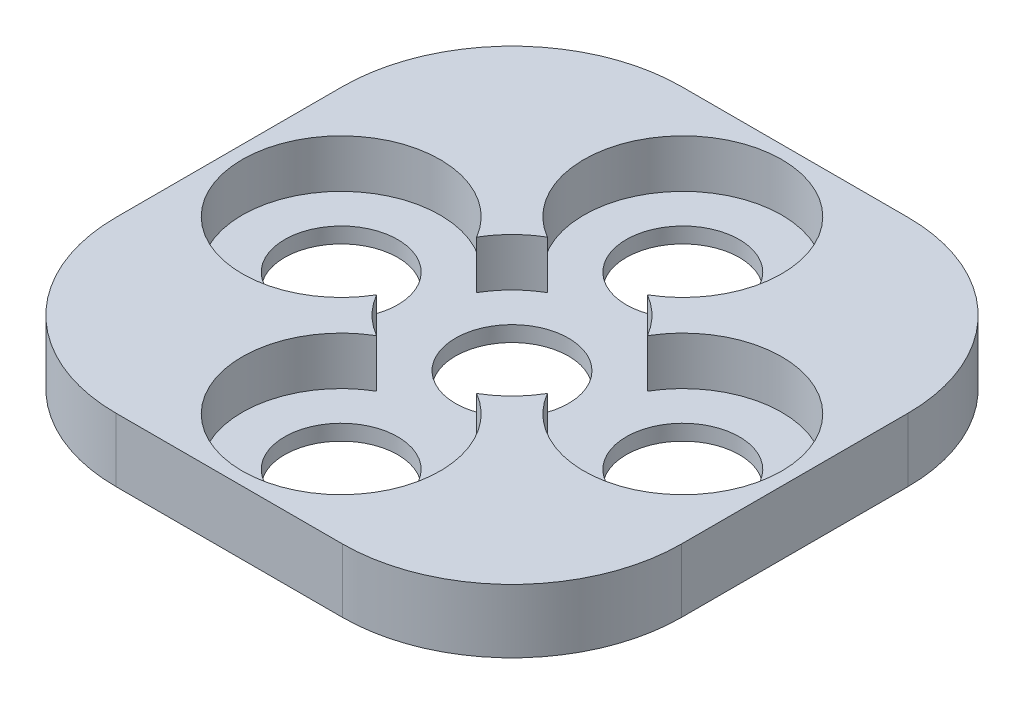
ISO-10303-21;
HEADER;
FILE_DESCRIPTION(('STEP AP214'),'2;1');
FILE_NAME('part.step','',(''),(''),'','','');
FILE_SCHEMA(('AUTOMOTIVE_DESIGN { 1 0 10303 214 1 1 1 1 }'));
ENDSEC;
DATA;
#1=APPLICATION_CONTEXT('core data for automotive mechanical design processes');
#2=APPLICATION_PROTOCOL_DEFINITION('international standard','automotive_design',2000,#1);
#3=PRODUCT_CONTEXT('',#1,'mechanical');
#4=PRODUCT('Part','Part','',(#3));
#5=PRODUCT_RELATED_PRODUCT_CATEGORY('part','',(#4));
#6=PRODUCT_DEFINITION_FORMATION('','',#4);
#7=PRODUCT_DEFINITION_CONTEXT('part definition',#1,'design');
#8=PRODUCT_DEFINITION('design','',#6,#7);
#9=PRODUCT_DEFINITION_SHAPE('','',#8);
#10=(LENGTH_UNIT() NAMED_UNIT(*) SI_UNIT(.MILLI.,.METRE.));
#11=(NAMED_UNIT(*) PLANE_ANGLE_UNIT() SI_UNIT($,.RADIAN.));
#12=(NAMED_UNIT(*) SI_UNIT($,.STERADIAN.) SOLID_ANGLE_UNIT());
#13=UNCERTAINTY_MEASURE_WITH_UNIT(LENGTH_MEASURE(1.E-05),#10,'distance_accuracy_value','');
#14=(GEOMETRIC_REPRESENTATION_CONTEXT(3) GLOBAL_UNCERTAINTY_ASSIGNED_CONTEXT((#13)) GLOBAL_UNIT_ASSIGNED_CONTEXT((#10,
#11,#12)) REPRESENTATION_CONTEXT('',''));
#15=CARTESIAN_POINT('',(0.,0.,0.));
#16=DIRECTION('',(0.,0.,1.));
#17=DIRECTION('',(1.,0.,0.));
#18=AXIS2_PLACEMENT_3D('',#15,#16,#17);
#19=CARTESIAN_POINT('',(0.,28.575,0.));
#20=DIRECTION('',(1.,0.,0.));
#21=DIRECTION('',(0.,0.,-1.));
#22=AXIS2_PLACEMENT_3D('',#19,#20,#21);
#23=PLANE('',#22);
#24=DIRECTION('',(0.,0.,1.));
#25=VECTOR('',#24,1.);
#26=CARTESIAN_POINT('',(0.,0.,0.));
#27=LINE('',#26,#25);
#28=CARTESIAN_POINT('',(0.,0.,-177.8));
#29=VERTEX_POINT('',#28);
#30=CARTESIAN_POINT('',(0.,0.,-76.2));
#31=VERTEX_POINT('',#30);
#32=EDGE_CURVE('E239',#29,#31,#27,.T.);
#33=ORIENTED_EDGE('',*,*,#32,.T.);
#34=DIRECTION('',(0.,-1.,0.));
#35=VECTOR('',#34,1.);
#36=CARTESIAN_POINT('',(0.,28.575,-76.2));
#37=LINE('',#36,#35);
#38=CARTESIAN_POINT('',(0.,28.575,-76.2));
#39=VERTEX_POINT('',#38);
#40=EDGE_CURVE('E311',#31,#39,#37,.F.);
#41=ORIENTED_EDGE('',*,*,#40,.T.);
#42=DIRECTION('',(0.,0.,1.));
#43=VECTOR('',#42,1.);
#44=CARTESIAN_POINT('',(0.,28.575,0.));
#45=LINE('',#44,#43);
#46=CARTESIAN_POINT('',(0.,28.575,-177.8));
#47=VERTEX_POINT('',#46);
#48=EDGE_CURVE('E257',#47,#39,#45,.T.);
#49=ORIENTED_EDGE('',*,*,#48,.F.);
#50=DIRECTION('',(0.,-1.,0.));
#51=VECTOR('',#50,1.);
#52=CARTESIAN_POINT('',(0.,28.575,-177.8));
#53=LINE('',#52,#51);
#54=EDGE_CURVE('E307',#47,#29,#53,.T.);
#55=ORIENTED_EDGE('',*,*,#54,.T.);
#56=EDGE_LOOP('',(#33,#41,#49,#55));
#57=FACE_BOUND('',#56,.T.);
#58=ADVANCED_FACE('F39',(#57),#23,.F.);
#59=CARTESIAN_POINT('',(0.,28.575,0.));
#60=DIRECTION('',(0.,0.,-1.));
#61=DIRECTION('',(-1.,0.,0.));
#62=AXIS2_PLACEMENT_3D('',#59,#60,#61);
#63=PLANE('',#62);
#64=DIRECTION('',(1.,0.,0.));
#65=VECTOR('',#64,1.);
#66=CARTESIAN_POINT('',(0.,28.575,0.));
#67=LINE('',#66,#65);
#68=CARTESIAN_POINT('',(76.2,28.575,0.));
#69=VERTEX_POINT('',#68);
#70=CARTESIAN_POINT('',(177.8,28.575,0.));
#71=VERTEX_POINT('',#70);
#72=EDGE_CURVE('E261',#69,#71,#67,.T.);
#73=ORIENTED_EDGE('',*,*,#72,.F.);
#74=DIRECTION('',(0.,-1.,0.));
#75=VECTOR('',#74,1.);
#76=CARTESIAN_POINT('',(76.2,28.575,0.));
#77=LINE('',#76,#75);
#78=CARTESIAN_POINT('',(76.2,0.,0.));
#79=VERTEX_POINT('',#78);
#80=EDGE_CURVE('E291',#69,#79,#77,.T.);
#81=ORIENTED_EDGE('',*,*,#80,.T.);
#82=DIRECTION('',(1.,0.,0.));
#83=VECTOR('',#82,1.);
#84=CARTESIAN_POINT('',(0.,0.,0.));
#85=LINE('',#84,#83);
#86=CARTESIAN_POINT('',(177.8,0.,0.));
#87=VERTEX_POINT('',#86);
#88=EDGE_CURVE('E276',#79,#87,#85,.T.);
#89=ORIENTED_EDGE('',*,*,#88,.T.);
#90=DIRECTION('',(0.,-1.,0.));
#91=VECTOR('',#90,1.);
#92=CARTESIAN_POINT('',(177.8,28.575,0.));
#93=LINE('',#92,#91);
#94=EDGE_CURVE('E272',#87,#71,#93,.F.);
#95=ORIENTED_EDGE('',*,*,#94,.T.);
#96=EDGE_LOOP('',(#73,#81,#89,#95));
#97=FACE_BOUND('',#96,.T.);
#98=ADVANCED_FACE('F363',(#97),#63,.F.);
#99=CARTESIAN_POINT('',(254.,28.575,0.));
#100=DIRECTION('',(-1.,0.,0.));
#101=DIRECTION('',(0.,0.,1.));
#102=AXIS2_PLACEMENT_3D('',#99,#100,#101);
#103=PLANE('',#102);
#104=DIRECTION('',(0.,0.,-1.));
#105=VECTOR('',#104,1.);
#106=CARTESIAN_POINT('',(254.,0.,0.));
#107=LINE('',#106,#105);
#108=CARTESIAN_POINT('',(254.,0.,-76.2));
#109=VERTEX_POINT('',#108);
#110=CARTESIAN_POINT('',(254.,0.,-177.8));
#111=VERTEX_POINT('',#110);
#112=EDGE_CURVE('E280',#109,#111,#107,.T.);
#113=ORIENTED_EDGE('',*,*,#112,.T.);
#114=DIRECTION('',(0.,-1.,0.));
#115=VECTOR('',#114,1.);
#116=CARTESIAN_POINT('',(254.,28.575,-177.8));
#117=LINE('',#116,#115);
#118=CARTESIAN_POINT('',(254.,28.575,-177.8));
#119=VERTEX_POINT('',#118);
#120=EDGE_CURVE('E11',#111,#119,#117,.F.);
#121=ORIENTED_EDGE('',*,*,#120,.T.);
#122=DIRECTION('',(0.,0.,-1.));
#123=VECTOR('',#122,1.);
#124=CARTESIAN_POINT('',(254.,28.575,0.));
#125=LINE('',#124,#123);
#126=CARTESIAN_POINT('',(254.,28.575,-76.2));
#127=VERTEX_POINT('',#126);
#128=EDGE_CURVE('E266',#127,#119,#125,.T.);
#129=ORIENTED_EDGE('',*,*,#128,.F.);
#130=DIRECTION('',(0.,-1.,0.));
#131=VECTOR('',#130,1.);
#132=CARTESIAN_POINT('',(254.,28.575,-76.2));
#133=LINE('',#132,#131);
#134=EDGE_CURVE('E48',#127,#109,#133,.T.);
#135=ORIENTED_EDGE('',*,*,#134,.T.);
#136=EDGE_LOOP('',(#113,#121,#129,#135));
#137=FACE_BOUND('',#136,.T.);
#138=ADVANCED_FACE('F336',(#137),#103,.F.);
#139=CARTESIAN_POINT('',(0.,28.575,-254.));
#140=DIRECTION('',(0.,0.,1.));
#141=DIRECTION('',(1.,0.,0.));
#142=AXIS2_PLACEMENT_3D('',#139,#140,#141);
#143=PLANE('',#142);
#144=DIRECTION('',(-1.,0.,0.));
#145=VECTOR('',#144,1.);
#146=CARTESIAN_POINT('',(0.,0.,-254.));
#147=LINE('',#146,#145);
#148=CARTESIAN_POINT('',(177.8,0.,-254.));
#149=VERTEX_POINT('',#148);
#150=CARTESIAN_POINT('',(76.2,0.,-254.));
#151=VERTEX_POINT('',#150);
#152=EDGE_CURVE('E262',#149,#151,#147,.T.);
#153=ORIENTED_EDGE('',*,*,#152,.T.);
#154=DIRECTION('',(0.,-1.,0.));
#155=VECTOR('',#154,1.);
#156=CARTESIAN_POINT('',(76.2,28.575,-254.));
#157=LINE('',#156,#155);
#158=CARTESIAN_POINT('',(76.2,28.575,-254.));
#159=VERTEX_POINT('',#158);
#160=EDGE_CURVE('E55',#151,#159,#157,.F.);
#161=ORIENTED_EDGE('',*,*,#160,.T.);
#162=DIRECTION('',(-1.,0.,0.));
#163=VECTOR('',#162,1.);
#164=CARTESIAN_POINT('',(0.,28.575,-254.));
#165=LINE('',#164,#163);
#166=CARTESIAN_POINT('',(177.8,28.575,-254.));
#167=VERTEX_POINT('',#166);
#168=EDGE_CURVE('E269',#167,#159,#165,.T.);
#169=ORIENTED_EDGE('',*,*,#168,.F.);
#170=DIRECTION('',(0.,-1.,0.));
#171=VECTOR('',#170,1.);
#172=CARTESIAN_POINT('',(177.8,28.575,-254.));
#173=LINE('',#172,#171);
#174=EDGE_CURVE('E325',#167,#149,#173,.T.);
#175=ORIENTED_EDGE('',*,*,#174,.T.);
#176=EDGE_LOOP('',(#153,#161,#169,#175));
#177=FACE_BOUND('',#176,.T.);
#178=ADVANCED_FACE('F347',(#177),#143,.F.);
#179=CARTESIAN_POINT('',(0.,28.575,0.));
#180=DIRECTION('',(0.,-1.,0.));
#181=DIRECTION('',(0.,0.,-1.));
#182=AXIS2_PLACEMENT_3D('',#179,#180,#181);
#183=PLANE('',#182);
#184=CARTESIAN_POINT('',(127.,28.575,-127.));
#185=DIRECTION('',(0.,1.,0.));
#186=DIRECTION('',(0.,0.,1.));
#187=AXIS2_PLACEMENT_3D('',#184,#185,#186);
#188=CIRCLE('',#187,44.45);
#189=CARTESIAN_POINT('',(165.354,28.575,-149.467157897696));
#190=VERTEX_POINT('',#189);
#191=CARTESIAN_POINT('',(149.467157897696,28.575,-165.354));
#192=VERTEX_POINT('',#191);
#193=EDGE_CURVE('E213',#190,#192,#188,.T.);
#194=ORIENTED_EDGE('',*,*,#193,.F.);
#195=CARTESIAN_POINT('',(203.708,28.575,-127.));
#196=DIRECTION('',(0.,1.,0.));
#197=DIRECTION('',(0.,0.,1.));
#198=AXIS2_PLACEMENT_3D('',#195,#196,#197);
#199=CIRCLE('',#198,44.45);
#200=CARTESIAN_POINT('',(165.354,28.575,-104.532842102304));
#201=VERTEX_POINT('',#200);
#202=EDGE_CURVE('E161',#201,#190,#199,.T.);
#203=ORIENTED_EDGE('',*,*,#202,.F.);
#204=CARTESIAN_POINT('',(127.,28.575,-127.));
#205=DIRECTION('',(0.,1.,0.));
#206=DIRECTION('',(0.,0.,1.));
#207=AXIS2_PLACEMENT_3D('',#204,#205,#206);
#208=CIRCLE('',#207,44.45);
#209=CARTESIAN_POINT('',(149.467157897696,28.575,-88.646));
#210=VERTEX_POINT('',#209);
#211=EDGE_CURVE('E182',#210,#201,#208,.T.);
#212=ORIENTED_EDGE('',*,*,#211,.F.);
#213=CARTESIAN_POINT('',(127.,28.575,-50.292));
#214=DIRECTION('',(0.,1.,0.));
#215=DIRECTION('',(0.,0.,1.));
#216=AXIS2_PLACEMENT_3D('',#213,#214,#215);
#217=CIRCLE('',#216,44.45);
#218=CARTESIAN_POINT('',(104.532842102304,28.575,-88.646));
#219=VERTEX_POINT('',#218);
#220=EDGE_CURVE('E186',#219,#210,#217,.T.);
#221=ORIENTED_EDGE('',*,*,#220,.F.);
#222=CARTESIAN_POINT('',(127.,28.575,-127.));
#223=DIRECTION('',(0.,1.,0.));
#224=DIRECTION('',(0.,0.,1.));
#225=AXIS2_PLACEMENT_3D('',#222,#223,#224);
#226=CIRCLE('',#225,44.45);
#227=CARTESIAN_POINT('',(88.646,28.575,-104.532842102304));
#228=VERTEX_POINT('',#227);
#229=EDGE_CURVE('E229',#228,#219,#226,.T.);
#230=ORIENTED_EDGE('',*,*,#229,.F.);
#231=CARTESIAN_POINT('',(50.292,28.575,-127.));
#232=DIRECTION('',(0.,1.,0.));
#233=DIRECTION('',(0.,0.,1.));
#234=AXIS2_PLACEMENT_3D('',#231,#232,#233);
#235=CIRCLE('',#234,44.45);
#236=CARTESIAN_POINT('',(88.646,28.575,-149.467157897696));
#237=VERTEX_POINT('',#236);
#238=EDGE_CURVE('E225',#237,#228,#235,.T.);
#239=ORIENTED_EDGE('',*,*,#238,.F.);
#240=CARTESIAN_POINT('',(127.,28.575,-127.));
#241=DIRECTION('',(0.,1.,0.));
#242=DIRECTION('',(0.,0.,1.));
#243=AXIS2_PLACEMENT_3D('',#240,#241,#242);
#244=CIRCLE('',#243,44.45);
#245=CARTESIAN_POINT('',(104.532842102304,28.575,-165.354));
#246=VERTEX_POINT('',#245);
#247=EDGE_CURVE('E221',#246,#237,#244,.T.);
#248=ORIENTED_EDGE('',*,*,#247,.F.);
#249=CARTESIAN_POINT('',(127.,28.575,-203.708));
#250=DIRECTION('',(0.,1.,0.));
#251=DIRECTION('',(0.,0.,1.));
#252=AXIS2_PLACEMENT_3D('',#249,#250,#251);
#253=CIRCLE('',#252,44.45);
#254=EDGE_CURVE('E217',#192,#246,#253,.T.);
#255=ORIENTED_EDGE('',*,*,#254,.F.);
#256=EDGE_LOOP('',(#194,#203,#212,#221,#230,#239,#248,#255));
#257=FACE_BOUND('',#256,.T.);
#258=ORIENTED_EDGE('',*,*,#48,.T.);
#259=CARTESIAN_POINT('',(76.2,28.575,-76.2));
#260=DIRECTION('',(0.,-1.,0.));
#261=DIRECTION('',(0.,0.,-1.));
#262=AXIS2_PLACEMENT_3D('',#259,#260,#261);
#263=CIRCLE('',#262,76.2);
#264=EDGE_CURVE('E322',#39,#69,#263,.F.);
#265=ORIENTED_EDGE('',*,*,#264,.T.);
#266=ORIENTED_EDGE('',*,*,#72,.T.);
#267=CARTESIAN_POINT('',(177.8,28.575,-76.2));
#268=DIRECTION('',(0.,-1.,0.));
#269=DIRECTION('',(0.,0.,-1.));
#270=AXIS2_PLACEMENT_3D('',#267,#268,#269);
#271=CIRCLE('',#270,76.2);
#272=EDGE_CURVE('E314',#71,#127,#271,.F.);
#273=ORIENTED_EDGE('',*,*,#272,.T.);
#274=ORIENTED_EDGE('',*,*,#128,.T.);
#275=CARTESIAN_POINT('',(177.8,28.575,-177.8));
#276=DIRECTION('',(0.,-1.,0.));
#277=DIRECTION('',(0.,0.,-1.));
#278=AXIS2_PLACEMENT_3D('',#275,#276,#277);
#279=CIRCLE('',#278,76.2);
#280=EDGE_CURVE('E62',#119,#167,#279,.F.);
#281=ORIENTED_EDGE('',*,*,#280,.T.);
#282=ORIENTED_EDGE('',*,*,#168,.T.);
#283=CARTESIAN_POINT('',(76.2,28.575,-177.8));
#284=DIRECTION('',(0.,-1.,0.));
#285=DIRECTION('',(0.,0.,-1.));
#286=AXIS2_PLACEMENT_3D('',#283,#284,#285);
#287=CIRCLE('',#286,76.2);
#288=EDGE_CURVE('E319',#159,#47,#287,.F.);
#289=ORIENTED_EDGE('',*,*,#288,.T.);
#290=EDGE_LOOP('',(#258,#265,#266,#273,#274,#281,#282,#289));
#291=FACE_BOUND('',#290,.T.);
#292=ADVANCED_FACE('F349',(#257,#291),#183,.F.);
#293=CARTESIAN_POINT('',(0.,0.,0.));
#294=DIRECTION('',(0.,-1.,0.));
#295=DIRECTION('',(0.,0.,-1.));
#296=AXIS2_PLACEMENT_3D('',#293,#294,#295);
#297=PLANE('',#296);
#298=CARTESIAN_POINT('',(127.,0.,-50.292));
#299=DIRECTION('',(0.,-1.,0.));
#300=DIRECTION('',(0.,0.,-1.));
#301=AXIS2_PLACEMENT_3D('',#298,#299,#300);
#302=CIRCLE('',#301,25.4);
#303=CARTESIAN_POINT('',(127.,0.,-75.692));
#304=VERTEX_POINT('',#303);
#305=EDGE_CURVE('E189',#304,#304,#302,.T.);
#306=ORIENTED_EDGE('',*,*,#305,.F.);
#307=EDGE_LOOP('',(#306));
#308=FACE_BOUND('',#307,.T.);
#309=CARTESIAN_POINT('',(50.292,0.,-127.));
#310=DIRECTION('',(0.,-1.,0.));
#311=DIRECTION('',(0.,0.,-1.));
#312=AXIS2_PLACEMENT_3D('',#309,#310,#311);
#313=CIRCLE('',#312,25.4);
#314=CARTESIAN_POINT('',(50.292,0.,-152.4));
#315=VERTEX_POINT('',#314);
#316=EDGE_CURVE('E601',#315,#315,#313,.T.);
#317=ORIENTED_EDGE('',*,*,#316,.F.);
#318=EDGE_LOOP('',(#317));
#319=FACE_BOUND('',#318,.T.);
#320=CARTESIAN_POINT('',(127.,0.,-203.708));
#321=DIRECTION('',(0.,-1.,0.));
#322=DIRECTION('',(0.,0.,-1.));
#323=AXIS2_PLACEMENT_3D('',#320,#321,#322);
#324=CIRCLE('',#323,25.4);
#325=CARTESIAN_POINT('',(127.,0.,-229.108));
#326=VERTEX_POINT('',#325);
#327=EDGE_CURVE('E605',#326,#326,#324,.T.);
#328=ORIENTED_EDGE('',*,*,#327,.F.);
#329=EDGE_LOOP('',(#328));
#330=FACE_BOUND('',#329,.T.);
#331=CARTESIAN_POINT('',(203.708,0.,-127.));
#332=DIRECTION('',(0.,-1.,0.));
#333=DIRECTION('',(0.,0.,-1.));
#334=AXIS2_PLACEMENT_3D('',#331,#332,#333);
#335=CIRCLE('',#334,25.4);
#336=CARTESIAN_POINT('',(203.708,0.,-152.4));
#337=VERTEX_POINT('',#336);
#338=EDGE_CURVE('E214',#337,#337,#335,.T.);
#339=ORIENTED_EDGE('',*,*,#338,.F.);
#340=EDGE_LOOP('',(#339));
#341=FACE_BOUND('',#340,.T.);
#342=CARTESIAN_POINT('',(127.,0.,-127.));
#343=DIRECTION('',(0.,-1.,0.));
#344=DIRECTION('',(0.,0.,-1.));
#345=AXIS2_PLACEMENT_3D('',#342,#343,#344);
#346=CIRCLE('',#345,25.4);
#347=CARTESIAN_POINT('',(127.,0.,-152.4));
#348=VERTEX_POINT('',#347);
#349=EDGE_CURVE('E610',#348,#348,#346,.T.);
#350=ORIENTED_EDGE('',*,*,#349,.F.);
#351=EDGE_LOOP('',(#350));
#352=FACE_BOUND('',#351,.T.);
#353=ORIENTED_EDGE('',*,*,#88,.F.);
#354=CARTESIAN_POINT('',(76.2,0.,-76.2));
#355=DIRECTION('',(0.,-1.,0.));
#356=DIRECTION('',(0.,0.,-1.));
#357=AXIS2_PLACEMENT_3D('',#354,#355,#356);
#358=CIRCLE('',#357,76.2);
#359=EDGE_CURVE('E304',#79,#31,#358,.T.);
#360=ORIENTED_EDGE('',*,*,#359,.T.);
#361=ORIENTED_EDGE('',*,*,#32,.F.);
#362=CARTESIAN_POINT('',(76.2,0.,-177.8));
#363=DIRECTION('',(0.,-1.,0.));
#364=DIRECTION('',(0.,0.,-1.));
#365=AXIS2_PLACEMENT_3D('',#362,#363,#364);
#366=CIRCLE('',#365,76.2);
#367=EDGE_CURVE('E301',#29,#151,#366,.T.);
#368=ORIENTED_EDGE('',*,*,#367,.T.);
#369=ORIENTED_EDGE('',*,*,#152,.F.);
#370=CARTESIAN_POINT('',(177.8,0.,-177.8));
#371=DIRECTION('',(0.,-1.,0.));
#372=DIRECTION('',(0.,0.,-1.));
#373=AXIS2_PLACEMENT_3D('',#370,#371,#372);
#374=CIRCLE('',#373,76.2);
#375=EDGE_CURVE('E298',#149,#111,#374,.T.);
#376=ORIENTED_EDGE('',*,*,#375,.T.);
#377=ORIENTED_EDGE('',*,*,#112,.F.);
#378=CARTESIAN_POINT('',(177.8,0.,-76.2));
#379=DIRECTION('',(0.,-1.,0.));
#380=DIRECTION('',(0.,0.,-1.));
#381=AXIS2_PLACEMENT_3D('',#378,#379,#380);
#382=CIRCLE('',#381,76.2);
#383=EDGE_CURVE('E295',#109,#87,#382,.T.);
#384=ORIENTED_EDGE('',*,*,#383,.T.);
#385=EDGE_LOOP('',(#353,#360,#361,#368,#369,#376,#377,#384));
#386=FACE_BOUND('',#385,.T.);
#387=ADVANCED_FACE('F342',(#308,#319,#330,#341,#352,#386),#297,.T.);
#388=CARTESIAN_POINT('',(203.708,6.985,-127.));
#389=DIRECTION('',(0.,1.,0.));
#390=DIRECTION('',(0.,0.,1.));
#391=AXIS2_PLACEMENT_3D('',#388,#389,#390);
#392=CYLINDRICAL_SURFACE('',#391,44.45);
#393=ORIENTED_EDGE('',*,*,#202,.T.);
#394=DIRECTION('',(0.,1.,0.));
#395=VECTOR('',#394,1.);
#396=CARTESIAN_POINT('',(165.354,6.985,-149.467157897696));
#397=LINE('',#396,#395);
#398=CARTESIAN_POINT('',(165.354,6.985,-149.467157897696));
#399=VERTEX_POINT('',#398);
#400=EDGE_CURVE('E154',#399,#190,#397,.T.);
#401=ORIENTED_EDGE('',*,*,#400,.F.);
#402=CARTESIAN_POINT('',(203.708,6.985,-127.));
#403=DIRECTION('',(0.,1.,0.));
#404=DIRECTION('',(0.,0.,1.));
#405=AXIS2_PLACEMENT_3D('',#402,#403,#404);
#406=CIRCLE('',#405,44.45);
#407=CARTESIAN_POINT('',(165.354,6.985,-104.532842102304));
#408=VERTEX_POINT('',#407);
#409=EDGE_CURVE('E158',#408,#399,#406,.T.);
#410=ORIENTED_EDGE('',*,*,#409,.F.);
#411=DIRECTION('',(0.,1.,0.));
#412=VECTOR('',#411,1.);
#413=CARTESIAN_POINT('',(165.354,6.985,-104.532842102304));
#414=LINE('',#413,#412);
#415=EDGE_CURVE('E236',#408,#201,#414,.T.);
#416=ORIENTED_EDGE('',*,*,#415,.T.);
#417=EDGE_LOOP('',(#393,#401,#410,#416));
#418=FACE_BOUND('',#417,.T.);
#419=ADVANCED_FACE('F156',(#418),#392,.F.);
#420=CARTESIAN_POINT('',(127.,6.985,-127.));
#421=DIRECTION('',(0.,1.,0.));
#422=DIRECTION('',(0.,0.,1.));
#423=AXIS2_PLACEMENT_3D('',#420,#421,#422);
#424=CYLINDRICAL_SURFACE('',#423,44.45);
#425=ORIENTED_EDGE('',*,*,#211,.T.);
#426=ORIENTED_EDGE('',*,*,#415,.F.);
#427=CARTESIAN_POINT('',(127.,6.985,-127.));
#428=DIRECTION('',(0.,1.,0.));
#429=DIRECTION('',(0.,0.,1.));
#430=AXIS2_PLACEMENT_3D('',#427,#428,#429);
#431=CIRCLE('',#430,44.45);
#432=CARTESIAN_POINT('',(149.467157897696,6.985,-88.646));
#433=VERTEX_POINT('',#432);
#434=EDGE_CURVE('E167',#433,#408,#431,.T.);
#435=ORIENTED_EDGE('',*,*,#434,.F.);
#436=DIRECTION('',(0.,1.,0.));
#437=VECTOR('',#436,1.);
#438=CARTESIAN_POINT('',(149.467157897696,6.985,-88.646));
#439=LINE('',#438,#437);
#440=EDGE_CURVE('E240',#433,#210,#439,.T.);
#441=ORIENTED_EDGE('',*,*,#440,.T.);
#442=EDGE_LOOP('',(#425,#426,#435,#441));
#443=FACE_BOUND('',#442,.T.);
#444=ADVANCED_FACE('F518',(#443),#424,.F.);
#445=CARTESIAN_POINT('',(127.,6.985,-50.292));
#446=DIRECTION('',(0.,1.,0.));
#447=DIRECTION('',(0.,0.,1.));
#448=AXIS2_PLACEMENT_3D('',#445,#446,#447);
#449=CYLINDRICAL_SURFACE('',#448,44.45);
#450=ORIENTED_EDGE('',*,*,#220,.T.);
#451=ORIENTED_EDGE('',*,*,#440,.F.);
#452=CARTESIAN_POINT('',(127.,6.985,-50.292));
#453=DIRECTION('',(0.,1.,0.));
#454=DIRECTION('',(0.,0.,1.));
#455=AXIS2_PLACEMENT_3D('',#452,#453,#454);
#456=CIRCLE('',#455,44.45);
#457=CARTESIAN_POINT('',(104.532842102304,6.985,-88.646));
#458=VERTEX_POINT('',#457);
#459=EDGE_CURVE('E206',#458,#433,#456,.T.);
#460=ORIENTED_EDGE('',*,*,#459,.F.);
#461=DIRECTION('',(0.,1.,0.));
#462=VECTOR('',#461,1.);
#463=CARTESIAN_POINT('',(104.532842102304,6.985,-88.646));
#464=LINE('',#463,#462);
#465=EDGE_CURVE('E243',#458,#219,#464,.T.);
#466=ORIENTED_EDGE('',*,*,#465,.T.);
#467=EDGE_LOOP('',(#450,#451,#460,#466));
#468=FACE_BOUND('',#467,.T.);
#469=ADVANCED_FACE('F507',(#468),#449,.F.);
#470=CARTESIAN_POINT('',(127.,6.985,-127.));
#471=DIRECTION('',(0.,1.,0.));
#472=DIRECTION('',(0.,0.,1.));
#473=AXIS2_PLACEMENT_3D('',#470,#471,#472);
#474=CYLINDRICAL_SURFACE('',#473,44.45);
#475=ORIENTED_EDGE('',*,*,#229,.T.);
#476=ORIENTED_EDGE('',*,*,#465,.F.);
#477=CARTESIAN_POINT('',(127.,6.985,-127.));
#478=DIRECTION('',(0.,1.,0.));
#479=DIRECTION('',(0.,0.,1.));
#480=AXIS2_PLACEMENT_3D('',#477,#478,#479);
#481=CIRCLE('',#480,44.45);
#482=CARTESIAN_POINT('',(88.646,6.985,-104.532842102304));
#483=VERTEX_POINT('',#482);
#484=EDGE_CURVE('E202',#483,#458,#481,.T.);
#485=ORIENTED_EDGE('',*,*,#484,.F.);
#486=DIRECTION('',(0.,1.,0.));
#487=VECTOR('',#486,1.);
#488=CARTESIAN_POINT('',(88.646,6.985,-104.532842102304));
#489=LINE('',#488,#487);
#490=EDGE_CURVE('E246',#483,#228,#489,.T.);
#491=ORIENTED_EDGE('',*,*,#490,.T.);
#492=EDGE_LOOP('',(#475,#476,#485,#491));
#493=FACE_BOUND('',#492,.T.);
#494=ADVANCED_FACE('F496',(#493),#474,.F.);
#495=CARTESIAN_POINT('',(50.292,6.985,-127.));
#496=DIRECTION('',(0.,1.,0.));
#497=DIRECTION('',(0.,0.,1.));
#498=AXIS2_PLACEMENT_3D('',#495,#496,#497);
#499=CYLINDRICAL_SURFACE('',#498,44.45);
#500=ORIENTED_EDGE('',*,*,#238,.T.);
#501=ORIENTED_EDGE('',*,*,#490,.F.);
#502=CARTESIAN_POINT('',(50.292,6.985,-127.));
#503=DIRECTION('',(0.,1.,0.));
#504=DIRECTION('',(0.,0.,1.));
#505=AXIS2_PLACEMENT_3D('',#502,#503,#504);
#506=CIRCLE('',#505,44.45);
#507=CARTESIAN_POINT('',(88.646,6.985,-149.467157897696));
#508=VERTEX_POINT('',#507);
#509=EDGE_CURVE('E198',#508,#483,#506,.T.);
#510=ORIENTED_EDGE('',*,*,#509,.F.);
#511=DIRECTION('',(0.,1.,0.));
#512=VECTOR('',#511,1.);
#513=CARTESIAN_POINT('',(88.646,6.985,-149.467157897696));
#514=LINE('',#513,#512);
#515=EDGE_CURVE('E249',#508,#237,#514,.T.);
#516=ORIENTED_EDGE('',*,*,#515,.T.);
#517=EDGE_LOOP('',(#500,#501,#510,#516));
#518=FACE_BOUND('',#517,.T.);
#519=ADVANCED_FACE('F485',(#518),#499,.F.);
#520=CARTESIAN_POINT('',(127.,6.985,-127.));
#521=DIRECTION('',(0.,1.,0.));
#522=DIRECTION('',(0.,0.,1.));
#523=AXIS2_PLACEMENT_3D('',#520,#521,#522);
#524=CYLINDRICAL_SURFACE('',#523,44.45);
#525=ORIENTED_EDGE('',*,*,#247,.T.);
#526=ORIENTED_EDGE('',*,*,#515,.F.);
#527=CARTESIAN_POINT('',(127.,6.985,-127.));
#528=DIRECTION('',(0.,1.,0.));
#529=DIRECTION('',(0.,0.,1.));
#530=AXIS2_PLACEMENT_3D('',#527,#528,#529);
#531=CIRCLE('',#530,44.45);
#532=CARTESIAN_POINT('',(104.532842102304,6.985,-165.354));
#533=VERTEX_POINT('',#532);
#534=EDGE_CURVE('E194',#533,#508,#531,.T.);
#535=ORIENTED_EDGE('',*,*,#534,.F.);
#536=DIRECTION('',(0.,1.,0.));
#537=VECTOR('',#536,1.);
#538=CARTESIAN_POINT('',(104.532842102304,6.985,-165.354));
#539=LINE('',#538,#537);
#540=EDGE_CURVE('E252',#533,#246,#539,.T.);
#541=ORIENTED_EDGE('',*,*,#540,.T.);
#542=EDGE_LOOP('',(#525,#526,#535,#541));
#543=FACE_BOUND('',#542,.T.);
#544=ADVANCED_FACE('F474',(#543),#524,.F.);
#545=CARTESIAN_POINT('',(127.,6.985,-203.708));
#546=DIRECTION('',(0.,1.,0.));
#547=DIRECTION('',(0.,0.,1.));
#548=AXIS2_PLACEMENT_3D('',#545,#546,#547);
#549=CYLINDRICAL_SURFACE('',#548,44.45);
#550=ORIENTED_EDGE('',*,*,#254,.T.);
#551=ORIENTED_EDGE('',*,*,#540,.F.);
#552=CARTESIAN_POINT('',(127.,6.985,-203.708));
#553=DIRECTION('',(0.,1.,0.));
#554=DIRECTION('',(0.,0.,1.));
#555=AXIS2_PLACEMENT_3D('',#552,#553,#554);
#556=CIRCLE('',#555,44.45);
#557=CARTESIAN_POINT('',(149.467157897696,6.985,-165.354));
#558=VERTEX_POINT('',#557);
#559=EDGE_CURVE('E176',#558,#533,#556,.T.);
#560=ORIENTED_EDGE('',*,*,#559,.F.);
#561=DIRECTION('',(0.,1.,0.));
#562=VECTOR('',#561,1.);
#563=CARTESIAN_POINT('',(149.467157897696,6.985,-165.354));
#564=LINE('',#563,#562);
#565=EDGE_CURVE('E166',#558,#192,#564,.T.);
#566=ORIENTED_EDGE('',*,*,#565,.T.);
#567=EDGE_LOOP('',(#550,#551,#560,#566));
#568=FACE_BOUND('',#567,.T.);
#569=ADVANCED_FACE('F462',(#568),#549,.F.);
#570=CARTESIAN_POINT('',(127.,6.985,-127.));
#571=DIRECTION('',(0.,1.,0.));
#572=DIRECTION('',(0.,0.,1.));
#573=AXIS2_PLACEMENT_3D('',#570,#571,#572);
#574=CYLINDRICAL_SURFACE('',#573,44.45);
#575=ORIENTED_EDGE('',*,*,#193,.T.);
#576=ORIENTED_EDGE('',*,*,#565,.F.);
#577=CARTESIAN_POINT('',(127.,6.985,-127.));
#578=DIRECTION('',(0.,1.,0.));
#579=DIRECTION('',(0.,0.,1.));
#580=AXIS2_PLACEMENT_3D('',#577,#578,#579);
#581=CIRCLE('',#580,44.45);
#582=EDGE_CURVE('E170',#399,#558,#581,.T.);
#583=ORIENTED_EDGE('',*,*,#582,.F.);
#584=ORIENTED_EDGE('',*,*,#400,.T.);
#585=EDGE_LOOP('',(#575,#576,#583,#584));
#586=FACE_BOUND('',#585,.T.);
#587=ADVANCED_FACE('F171',(#586),#574,.F.);
#588=CARTESIAN_POINT('',(0.,6.985,0.));
#589=DIRECTION('',(0.,1.,0.));
#590=DIRECTION('',(0.,0.,1.));
#591=AXIS2_PLACEMENT_3D('',#588,#589,#590);
#592=PLANE('',#591);
#593=CARTESIAN_POINT('',(203.708,6.985,-127.));
#594=DIRECTION('',(0.,1.,0.));
#595=DIRECTION('',(0.,0.,1.));
#596=AXIS2_PLACEMENT_3D('',#593,#594,#595);
#597=CIRCLE('',#596,25.4);
#598=CARTESIAN_POINT('',(203.708,6.985,-101.6));
#599=VERTEX_POINT('',#598);
#600=EDGE_CURVE('E634',#599,#599,#597,.T.);
#601=ORIENTED_EDGE('',*,*,#600,.F.);
#602=EDGE_LOOP('',(#601));
#603=FACE_BOUND('',#602,.T.);
#604=CARTESIAN_POINT('',(127.,6.985,-50.292));
#605=DIRECTION('',(0.,1.,0.));
#606=DIRECTION('',(0.,0.,1.));
#607=AXIS2_PLACEMENT_3D('',#604,#605,#606);
#608=CIRCLE('',#607,25.4);
#609=CARTESIAN_POINT('',(127.,6.985,-24.892));
#610=VERTEX_POINT('',#609);
#611=EDGE_CURVE('E618',#610,#610,#608,.T.);
#612=ORIENTED_EDGE('',*,*,#611,.F.);
#613=EDGE_LOOP('',(#612));
#614=FACE_BOUND('',#613,.T.);
#615=CARTESIAN_POINT('',(50.292,6.985,-127.));
#616=DIRECTION('',(0.,1.,0.));
#617=DIRECTION('',(0.,0.,1.));
#618=AXIS2_PLACEMENT_3D('',#615,#616,#617);
#619=CIRCLE('',#618,25.4);
#620=CARTESIAN_POINT('',(50.292,6.985,-101.6));
#621=VERTEX_POINT('',#620);
#622=EDGE_CURVE('E628',#621,#621,#619,.T.);
#623=ORIENTED_EDGE('',*,*,#622,.F.);
#624=EDGE_LOOP('',(#623));
#625=FACE_BOUND('',#624,.T.);
#626=CARTESIAN_POINT('',(127.,6.985,-203.708));
#627=DIRECTION('',(0.,1.,0.));
#628=DIRECTION('',(0.,0.,1.));
#629=AXIS2_PLACEMENT_3D('',#626,#627,#628);
#630=CIRCLE('',#629,25.4);
#631=CARTESIAN_POINT('',(127.,6.985,-178.308));
#632=VERTEX_POINT('',#631);
#633=EDGE_CURVE('E632',#632,#632,#630,.T.);
#634=ORIENTED_EDGE('',*,*,#633,.F.);
#635=EDGE_LOOP('',(#634));
#636=FACE_BOUND('',#635,.T.);
#637=CARTESIAN_POINT('',(127.,6.985,-127.));
#638=DIRECTION('',(0.,1.,0.));
#639=DIRECTION('',(0.,0.,1.));
#640=AXIS2_PLACEMENT_3D('',#637,#638,#639);
#641=CIRCLE('',#640,25.4);
#642=CARTESIAN_POINT('',(127.,6.985,-101.6));
#643=VERTEX_POINT('',#642);
#644=EDGE_CURVE('E612',#643,#643,#641,.T.);
#645=ORIENTED_EDGE('',*,*,#644,.F.);
#646=EDGE_LOOP('',(#645));
#647=FACE_BOUND('',#646,.T.);
#648=ORIENTED_EDGE('',*,*,#409,.T.);
#649=ORIENTED_EDGE('',*,*,#582,.T.);
#650=ORIENTED_EDGE('',*,*,#559,.T.);
#651=ORIENTED_EDGE('',*,*,#534,.T.);
#652=ORIENTED_EDGE('',*,*,#509,.T.);
#653=ORIENTED_EDGE('',*,*,#484,.T.);
#654=ORIENTED_EDGE('',*,*,#459,.T.);
#655=ORIENTED_EDGE('',*,*,#434,.T.);
#656=EDGE_LOOP('',(#648,#649,#650,#651,#652,#653,#654,#655));
#657=FACE_BOUND('',#656,.T.);
#658=ADVANCED_FACE('F178',(#603,#614,#625,#636,#647,#657),#592,.T.);
#659=CARTESIAN_POINT('',(127.,-9.525,-127.));
#660=DIRECTION('',(0.,1.,0.));
#661=DIRECTION('',(0.,0.,1.));
#662=AXIS2_PLACEMENT_3D('',#659,#660,#661);
#663=CYLINDRICAL_SURFACE('',#662,25.4);
#664=ORIENTED_EDGE('',*,*,#349,.T.);
#665=EDGE_LOOP('',(#664));
#666=FACE_BOUND('',#665,.T.);
#667=ORIENTED_EDGE('',*,*,#644,.T.);
#668=EDGE_LOOP('',(#667));
#669=FACE_BOUND('',#668,.T.);
#670=ADVANCED_FACE('F437',(#666,#669),#663,.F.);
#671=CARTESIAN_POINT('',(127.,-9.525,-203.708));
#672=DIRECTION('',(0.,1.,0.));
#673=DIRECTION('',(0.,0.,1.));
#674=AXIS2_PLACEMENT_3D('',#671,#672,#673);
#675=CYLINDRICAL_SURFACE('',#674,25.4);
#676=ORIENTED_EDGE('',*,*,#327,.T.);
#677=EDGE_LOOP('',(#676));
#678=FACE_BOUND('',#677,.T.);
#679=ORIENTED_EDGE('',*,*,#633,.T.);
#680=EDGE_LOOP('',(#679));
#681=FACE_BOUND('',#680,.T.);
#682=ADVANCED_FACE('F428',(#678,#681),#675,.F.);
#683=CARTESIAN_POINT('',(50.292,-9.525,-127.));
#684=DIRECTION('',(0.,1.,0.));
#685=DIRECTION('',(0.,0.,1.));
#686=AXIS2_PLACEMENT_3D('',#683,#684,#685);
#687=CYLINDRICAL_SURFACE('',#686,25.4);
#688=ORIENTED_EDGE('',*,*,#316,.T.);
#689=EDGE_LOOP('',(#688));
#690=FACE_BOUND('',#689,.T.);
#691=ORIENTED_EDGE('',*,*,#622,.T.);
#692=EDGE_LOOP('',(#691));
#693=FACE_BOUND('',#692,.T.);
#694=ADVANCED_FACE('F419',(#690,#693),#687,.F.);
#695=CARTESIAN_POINT('',(127.,-9.525,-50.292));
#696=DIRECTION('',(0.,1.,0.));
#697=DIRECTION('',(0.,0.,1.));
#698=AXIS2_PLACEMENT_3D('',#695,#696,#697);
#699=CYLINDRICAL_SURFACE('',#698,25.4);
#700=ORIENTED_EDGE('',*,*,#305,.T.);
#701=EDGE_LOOP('',(#700));
#702=FACE_BOUND('',#701,.T.);
#703=ORIENTED_EDGE('',*,*,#611,.T.);
#704=EDGE_LOOP('',(#703));
#705=FACE_BOUND('',#704,.T.);
#706=ADVANCED_FACE('F410',(#702,#705),#699,.F.);
#707=CARTESIAN_POINT('',(203.708,-9.525,-127.));
#708=DIRECTION('',(0.,1.,0.));
#709=DIRECTION('',(0.,0.,1.));
#710=AXIS2_PLACEMENT_3D('',#707,#708,#709);
#711=CYLINDRICAL_SURFACE('',#710,25.4);
#712=ORIENTED_EDGE('',*,*,#338,.T.);
#713=EDGE_LOOP('',(#712));
#714=FACE_BOUND('',#713,.T.);
#715=ORIENTED_EDGE('',*,*,#600,.T.);
#716=EDGE_LOOP('',(#715));
#717=FACE_BOUND('',#716,.T.);
#718=ADVANCED_FACE('F379',(#714,#717),#711,.F.);
#719=CARTESIAN_POINT('',(76.2,28.575,-76.2));
#720=DIRECTION('',(0.,-1.,0.));
#721=DIRECTION('',(0.,0.,-1.));
#722=AXIS2_PLACEMENT_3D('',#719,#720,#721);
#723=CYLINDRICAL_SURFACE('',#722,76.2);
#724=ORIENTED_EDGE('',*,*,#264,.F.);
#725=ORIENTED_EDGE('',*,*,#40,.F.);
#726=ORIENTED_EDGE('',*,*,#359,.F.);
#727=ORIENTED_EDGE('',*,*,#80,.F.);
#728=EDGE_LOOP('',(#724,#725,#726,#727));
#729=FACE_BOUND('',#728,.T.);
#730=ADVANCED_FACE('F360',(#729),#723,.T.);
#731=CARTESIAN_POINT('',(76.2,28.575,-177.8));
#732=DIRECTION('',(0.,-1.,0.));
#733=DIRECTION('',(0.,0.,-1.));
#734=AXIS2_PLACEMENT_3D('',#731,#732,#733);
#735=CYLINDRICAL_SURFACE('',#734,76.2);
#736=ORIENTED_EDGE('',*,*,#288,.F.);
#737=ORIENTED_EDGE('',*,*,#160,.F.);
#738=ORIENTED_EDGE('',*,*,#367,.F.);
#739=ORIENTED_EDGE('',*,*,#54,.F.);
#740=EDGE_LOOP('',(#736,#737,#738,#739));
#741=FACE_BOUND('',#740,.T.);
#742=ADVANCED_FACE('F353',(#741),#735,.T.);
#743=CARTESIAN_POINT('',(177.8,28.575,-177.8));
#744=DIRECTION('',(0.,-1.,0.));
#745=DIRECTION('',(0.,0.,-1.));
#746=AXIS2_PLACEMENT_3D('',#743,#744,#745);
#747=CYLINDRICAL_SURFACE('',#746,76.2);
#748=ORIENTED_EDGE('',*,*,#280,.F.);
#749=ORIENTED_EDGE('',*,*,#120,.F.);
#750=ORIENTED_EDGE('',*,*,#375,.F.);
#751=ORIENTED_EDGE('',*,*,#174,.F.);
#752=EDGE_LOOP('',(#748,#749,#750,#751));
#753=FACE_BOUND('',#752,.T.);
#754=ADVANCED_FACE('F346',(#753),#747,.T.);
#755=CARTESIAN_POINT('',(177.8,28.575,-76.2));
#756=DIRECTION('',(0.,-1.,0.));
#757=DIRECTION('',(0.,0.,-1.));
#758=AXIS2_PLACEMENT_3D('',#755,#756,#757);
#759=CYLINDRICAL_SURFACE('',#758,76.2);
#760=ORIENTED_EDGE('',*,*,#272,.F.);
#761=ORIENTED_EDGE('',*,*,#94,.F.);
#762=ORIENTED_EDGE('',*,*,#383,.F.);
#763=ORIENTED_EDGE('',*,*,#134,.F.);
#764=EDGE_LOOP('',(#760,#761,#762,#763));
#765=FACE_BOUND('',#764,.T.);
#766=ADVANCED_FACE('F41',(#765),#759,.T.);
#767=CLOSED_SHELL('',(#58,#98,#138,#178,#292,#387,#419,#444,#469,#494,#519,#544,#569,#587,#658,
#670,#682,#694,#706,#718,#730,#742,#754,#766));
#768=MANIFOLD_SOLID_BREP('B2',#767);
#769=ADVANCED_BREP_SHAPE_REPRESENTATION('',(#18,#768),#14);
#770=SHAPE_DEFINITION_REPRESENTATION(#9,#769);
ENDSEC;
END-ISO-10303-21;
